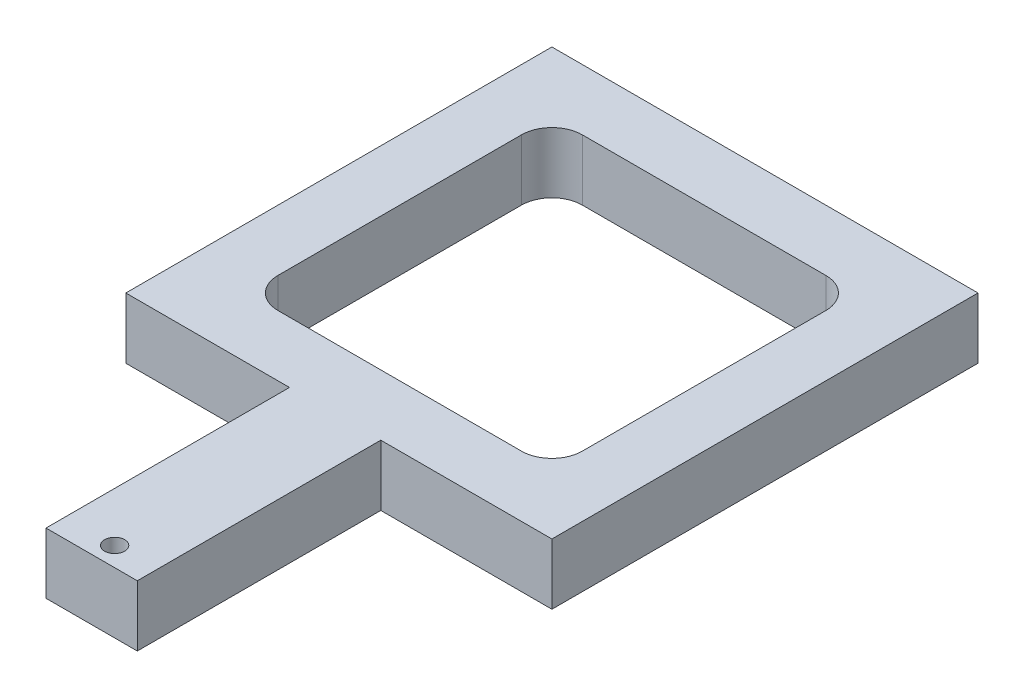
ISO-10303-21;
HEADER;
FILE_DESCRIPTION(('STEP AP214'),'2;1');
FILE_NAME('part.step','',(''),(''),'','','');
FILE_SCHEMA(('AUTOMOTIVE_DESIGN { 1 0 10303 214 1 1 1 1 }'));
ENDSEC;
DATA;
#1=APPLICATION_CONTEXT('core data for automotive mechanical design processes');
#2=APPLICATION_PROTOCOL_DEFINITION('international standard','automotive_design',2000,#1);
#3=PRODUCT_CONTEXT('',#1,'mechanical');
#4=PRODUCT('Part','Part','',(#3));
#5=PRODUCT_RELATED_PRODUCT_CATEGORY('part','',(#4));
#6=PRODUCT_DEFINITION_FORMATION('','',#4);
#7=PRODUCT_DEFINITION_CONTEXT('part definition',#1,'design');
#8=PRODUCT_DEFINITION('design','',#6,#7);
#9=PRODUCT_DEFINITION_SHAPE('','',#8);
#10=(LENGTH_UNIT() NAMED_UNIT(*) SI_UNIT(.MILLI.,.METRE.));
#11=(NAMED_UNIT(*) PLANE_ANGLE_UNIT() SI_UNIT($,.RADIAN.));
#12=(NAMED_UNIT(*) SI_UNIT($,.STERADIAN.) SOLID_ANGLE_UNIT());
#13=UNCERTAINTY_MEASURE_WITH_UNIT(LENGTH_MEASURE(1.E-05),#10,'distance_accuracy_value','');
#14=(GEOMETRIC_REPRESENTATION_CONTEXT(3) GLOBAL_UNCERTAINTY_ASSIGNED_CONTEXT((#13)) GLOBAL_UNIT_ASSIGNED_CONTEXT((#10,
#11,#12)) REPRESENTATION_CONTEXT('',''));
#15=CARTESIAN_POINT('',(0.,0.,0.));
#16=DIRECTION('',(0.,0.,1.));
#17=DIRECTION('',(1.,0.,0.));
#18=AXIS2_PLACEMENT_3D('',#15,#16,#17);
#19=CARTESIAN_POINT('',(0.,10.,0.));
#20=DIRECTION('',(0.,-1.,0.));
#21=DIRECTION('',(0.,0.,-1.));
#22=AXIS2_PLACEMENT_3D('',#19,#20,#21);
#23=PLANE('',#22);
#24=CARTESIAN_POINT('',(0.,10.,71.8381409105254));
#25=DIRECTION('',(0.,1.,0.));
#26=DIRECTION('',(0.,0.,1.));
#27=AXIS2_PLACEMENT_3D('',#24,#25,#26);
#28=CIRCLE('',#27,1.64603405631474);
#29=CARTESIAN_POINT('',(0.,10.,73.4841749668401));
#30=VERTEX_POINT('',#29);
#31=EDGE_CURVE('E369',#30,#30,#28,.T.);
#32=ORIENTED_EDGE('',*,*,#31,.F.);
#33=EDGE_LOOP('',(#32));
#34=FACE_BOUND('',#33,.T.);
#35=DIRECTION('',(1.,0.,0.));
#36=VECTOR('',#35,1.);
#37=CARTESIAN_POINT('',(6.88774581161821,10.,35.));
#38=LINE('',#37,#36);
#39=CARTESIAN_POINT('',(6.88774581161821,10.,35.));
#40=VERTEX_POINT('',#39);
#41=CARTESIAN_POINT('',(35.,10.,35.));
#42=VERTEX_POINT('',#41);
#43=EDGE_CURVE('E215',#40,#42,#38,.T.);
#44=ORIENTED_EDGE('',*,*,#43,.T.);
#45=DIRECTION('',(0.,0.,-1.));
#46=VECTOR('',#45,1.);
#47=CARTESIAN_POINT('',(35.,10.,-35.));
#48=LINE('',#47,#46);
#49=CARTESIAN_POINT('',(35.,10.,-35.));
#50=VERTEX_POINT('',#49);
#51=EDGE_CURVE('E218',#42,#50,#48,.T.);
#52=ORIENTED_EDGE('',*,*,#51,.T.);
#53=DIRECTION('',(-1.,0.,0.));
#54=VECTOR('',#53,1.);
#55=CARTESIAN_POINT('',(-35.,10.,-35.));
#56=LINE('',#55,#54);
#57=CARTESIAN_POINT('',(-35.,10.,-35.));
#58=VERTEX_POINT('',#57);
#59=EDGE_CURVE('E221',#50,#58,#56,.T.);
#60=ORIENTED_EDGE('',*,*,#59,.T.);
#61=DIRECTION('',(0.,0.,1.));
#62=VECTOR('',#61,1.);
#63=CARTESIAN_POINT('',(-35.,10.,-35.));
#64=LINE('',#63,#62);
#65=CARTESIAN_POINT('',(-35.,10.,35.));
#66=VERTEX_POINT('',#65);
#67=EDGE_CURVE('E223',#58,#66,#64,.T.);
#68=ORIENTED_EDGE('',*,*,#67,.T.);
#69=DIRECTION('',(1.,0.,0.));
#70=VECTOR('',#69,1.);
#71=CARTESIAN_POINT('',(-35.,10.,35.));
#72=LINE('',#71,#70);
#73=CARTESIAN_POINT('',(-8.1122541883818,10.,35.));
#74=VERTEX_POINT('',#73);
#75=EDGE_CURVE('E225',#66,#74,#72,.T.);
#76=ORIENTED_EDGE('',*,*,#75,.T.);
#77=DIRECTION('',(0.,0.,1.));
#78=VECTOR('',#77,1.);
#79=CARTESIAN_POINT('',(-8.1122541883818,10.,35.));
#80=LINE('',#79,#78);
#81=CARTESIAN_POINT('',(-8.11225418838179,10.,75.));
#82=VERTEX_POINT('',#81);
#83=EDGE_CURVE('E227',#74,#82,#80,.T.);
#84=ORIENTED_EDGE('',*,*,#83,.T.);
#85=DIRECTION('',(1.,0.,0.));
#86=VECTOR('',#85,1.);
#87=CARTESIAN_POINT('',(-8.11225418838179,10.,75.));
#88=LINE('',#87,#86);
#89=CARTESIAN_POINT('',(6.88774581161821,10.,75.));
#90=VERTEX_POINT('',#89);
#91=EDGE_CURVE('E229',#82,#90,#88,.T.);
#92=ORIENTED_EDGE('',*,*,#91,.T.);
#93=DIRECTION('',(0.,0.,-1.));
#94=VECTOR('',#93,1.);
#95=CARTESIAN_POINT('',(6.88774581161821,10.,75.));
#96=LINE('',#95,#94);
#97=EDGE_CURVE('E231',#90,#40,#96,.T.);
#98=ORIENTED_EDGE('',*,*,#97,.T.);
#99=EDGE_LOOP('',(#44,#52,#60,#68,#76,#84,#92,#98));
#100=FACE_BOUND('',#99,.T.);
#101=CARTESIAN_POINT('',(20.,10.,20.));
#102=DIRECTION('',(0.,1.,0.));
#103=DIRECTION('',(0.,0.,1.));
#104=AXIS2_PLACEMENT_3D('',#101,#102,#103);
#105=CIRCLE('',#104,5.);
#106=CARTESIAN_POINT('',(20.,10.,25.));
#107=VERTEX_POINT('',#106);
#108=CARTESIAN_POINT('',(25.,10.,20.));
#109=VERTEX_POINT('',#108);
#110=EDGE_CURVE('E148',#107,#109,#105,.T.);
#111=ORIENTED_EDGE('',*,*,#110,.F.);
#112=DIRECTION('',(1.,0.,0.));
#113=VECTOR('',#112,1.);
#114=CARTESIAN_POINT('',(-20.,10.,25.));
#115=LINE('',#114,#113);
#116=CARTESIAN_POINT('',(-20.,10.,25.));
#117=VERTEX_POINT('',#116);
#118=EDGE_CURVE('E182',#117,#107,#115,.T.);
#119=ORIENTED_EDGE('',*,*,#118,.F.);
#120=CARTESIAN_POINT('',(-20.,10.,20.));
#121=DIRECTION('',(0.,1.,0.));
#122=DIRECTION('',(0.,0.,-1.));
#123=AXIS2_PLACEMENT_3D('',#120,#121,#122);
#124=CIRCLE('',#123,5.);
#125=CARTESIAN_POINT('',(-25.,10.,20.));
#126=VERTEX_POINT('',#125);
#127=EDGE_CURVE('E180',#126,#117,#124,.T.);
#128=ORIENTED_EDGE('',*,*,#127,.F.);
#129=DIRECTION('',(0.,0.,1.));
#130=VECTOR('',#129,1.);
#131=CARTESIAN_POINT('',(-25.,10.,-20.));
#132=LINE('',#131,#130);
#133=CARTESIAN_POINT('',(-25.,10.,-20.));
#134=VERTEX_POINT('',#133);
#135=EDGE_CURVE('E178',#134,#126,#132,.T.);
#136=ORIENTED_EDGE('',*,*,#135,.F.);
#137=CARTESIAN_POINT('',(-20.,10.,-20.));
#138=DIRECTION('',(0.,1.,0.));
#139=DIRECTION('',(0.,0.,-1.));
#140=AXIS2_PLACEMENT_3D('',#137,#138,#139);
#141=CIRCLE('',#140,5.);
#142=CARTESIAN_POINT('',(-20.,10.,-25.));
#143=VERTEX_POINT('',#142);
#144=EDGE_CURVE('E176',#143,#134,#141,.T.);
#145=ORIENTED_EDGE('',*,*,#144,.F.);
#146=DIRECTION('',(-1.,0.,0.));
#147=VECTOR('',#146,1.);
#148=CARTESIAN_POINT('',(-20.,10.,-25.));
#149=LINE('',#148,#147);
#150=CARTESIAN_POINT('',(20.,10.,-25.));
#151=VERTEX_POINT('',#150);
#152=EDGE_CURVE('E171',#151,#143,#149,.T.);
#153=ORIENTED_EDGE('',*,*,#152,.F.);
#154=CARTESIAN_POINT('',(20.,10.,-20.));
#155=DIRECTION('',(0.,1.,0.));
#156=DIRECTION('',(0.,0.,1.));
#157=AXIS2_PLACEMENT_3D('',#154,#155,#156);
#158=CIRCLE('',#157,5.);
#159=CARTESIAN_POINT('',(25.,10.,-20.));
#160=VERTEX_POINT('',#159);
#161=EDGE_CURVE('E169',#160,#151,#158,.T.);
#162=ORIENTED_EDGE('',*,*,#161,.F.);
#163=DIRECTION('',(0.,0.,-1.));
#164=VECTOR('',#163,1.);
#165=CARTESIAN_POINT('',(25.,10.,-20.));
#166=LINE('',#165,#164);
#167=EDGE_CURVE('E156',#109,#160,#166,.T.);
#168=ORIENTED_EDGE('',*,*,#167,.F.);
#169=EDGE_LOOP('',(#111,#119,#128,#136,#145,#153,#162,#168));
#170=FACE_BOUND('',#169,.T.);
#171=ADVANCED_FACE('F35',(#34,#100,#170),#23,.F.);
#172=CARTESIAN_POINT('',(0.,0.,0.));
#173=DIRECTION('',(0.,-1.,0.));
#174=DIRECTION('',(0.,0.,-1.));
#175=AXIS2_PLACEMENT_3D('',#172,#173,#174);
#176=PLANE('',#175);
#177=CARTESIAN_POINT('',(0.,0.,71.8381409105254));
#178=DIRECTION('',(0.,1.,0.));
#179=DIRECTION('',(0.,0.,1.));
#180=AXIS2_PLACEMENT_3D('',#177,#178,#179);
#181=CIRCLE('',#180,1.64603405631474);
#182=CARTESIAN_POINT('',(0.,0.,73.4841749668401));
#183=VERTEX_POINT('',#182);
#184=EDGE_CURVE('E185',#183,#183,#181,.T.);
#185=ORIENTED_EDGE('',*,*,#184,.T.);
#186=EDGE_LOOP('',(#185));
#187=FACE_BOUND('',#186,.T.);
#188=DIRECTION('',(1.,0.,0.));
#189=VECTOR('',#188,1.);
#190=CARTESIAN_POINT('',(6.88774581161821,0.,35.));
#191=LINE('',#190,#189);
#192=CARTESIAN_POINT('',(6.88774581161821,0.,35.));
#193=VERTEX_POINT('',#192);
#194=CARTESIAN_POINT('',(35.,0.,35.));
#195=VERTEX_POINT('',#194);
#196=EDGE_CURVE('E164',#193,#195,#191,.T.);
#197=ORIENTED_EDGE('',*,*,#196,.F.);
#198=DIRECTION('',(0.,0.,-1.));
#199=VECTOR('',#198,1.);
#200=CARTESIAN_POINT('',(6.88774581161821,0.,75.));
#201=LINE('',#200,#199);
#202=CARTESIAN_POINT('',(6.88774581161821,0.,75.));
#203=VERTEX_POINT('',#202);
#204=EDGE_CURVE('E219',#203,#193,#201,.T.);
#205=ORIENTED_EDGE('',*,*,#204,.F.);
#206=DIRECTION('',(1.,0.,0.));
#207=VECTOR('',#206,1.);
#208=CARTESIAN_POINT('',(-8.11225418838179,0.,75.));
#209=LINE('',#208,#207);
#210=CARTESIAN_POINT('',(-8.11225418838179,0.,75.));
#211=VERTEX_POINT('',#210);
#212=EDGE_CURVE('E246',#211,#203,#209,.T.);
#213=ORIENTED_EDGE('',*,*,#212,.F.);
#214=DIRECTION('',(0.,0.,1.));
#215=VECTOR('',#214,1.);
#216=CARTESIAN_POINT('',(-8.1122541883818,0.,35.));
#217=LINE('',#216,#215);
#218=CARTESIAN_POINT('',(-8.1122541883818,0.,35.));
#219=VERTEX_POINT('',#218);
#220=EDGE_CURVE('E244',#219,#211,#217,.T.);
#221=ORIENTED_EDGE('',*,*,#220,.F.);
#222=DIRECTION('',(1.,0.,0.));
#223=VECTOR('',#222,1.);
#224=CARTESIAN_POINT('',(-35.,0.,35.));
#225=LINE('',#224,#223);
#226=CARTESIAN_POINT('',(-35.,0.,35.));
#227=VERTEX_POINT('',#226);
#228=EDGE_CURVE('E242',#227,#219,#225,.T.);
#229=ORIENTED_EDGE('',*,*,#228,.F.);
#230=DIRECTION('',(0.,0.,1.));
#231=VECTOR('',#230,1.);
#232=CARTESIAN_POINT('',(-35.,0.,-35.));
#233=LINE('',#232,#231);
#234=CARTESIAN_POINT('',(-35.,0.,-35.));
#235=VERTEX_POINT('',#234);
#236=EDGE_CURVE('E240',#235,#227,#233,.T.);
#237=ORIENTED_EDGE('',*,*,#236,.F.);
#238=DIRECTION('',(-1.,0.,0.));
#239=VECTOR('',#238,1.);
#240=CARTESIAN_POINT('',(-35.,0.,-35.));
#241=LINE('',#240,#239);
#242=CARTESIAN_POINT('',(35.,0.,-35.));
#243=VERTEX_POINT('',#242);
#244=EDGE_CURVE('E238',#243,#235,#241,.T.);
#245=ORIENTED_EDGE('',*,*,#244,.F.);
#246=DIRECTION('',(0.,0.,-1.));
#247=VECTOR('',#246,1.);
#248=CARTESIAN_POINT('',(35.,0.,-35.));
#249=LINE('',#248,#247);
#250=EDGE_CURVE('E236',#195,#243,#249,.T.);
#251=ORIENTED_EDGE('',*,*,#250,.F.);
#252=EDGE_LOOP('',(#197,#205,#213,#221,#229,#237,#245,#251));
#253=FACE_BOUND('',#252,.T.);
#254=DIRECTION('',(1.,0.,0.));
#255=VECTOR('',#254,1.);
#256=CARTESIAN_POINT('',(-20.,0.,25.));
#257=LINE('',#256,#255);
#258=CARTESIAN_POINT('',(-20.,0.,25.));
#259=VERTEX_POINT('',#258);
#260=CARTESIAN_POINT('',(20.,0.,25.));
#261=VERTEX_POINT('',#260);
#262=EDGE_CURVE('E157',#259,#261,#257,.T.);
#263=ORIENTED_EDGE('',*,*,#262,.T.);
#264=CARTESIAN_POINT('',(20.,0.,20.));
#265=DIRECTION('',(0.,1.,0.));
#266=DIRECTION('',(0.,0.,1.));
#267=AXIS2_PLACEMENT_3D('',#264,#265,#266);
#268=CIRCLE('',#267,5.);
#269=CARTESIAN_POINT('',(25.,0.,20.));
#270=VERTEX_POINT('',#269);
#271=EDGE_CURVE('E58',#261,#270,#268,.T.);
#272=ORIENTED_EDGE('',*,*,#271,.T.);
#273=DIRECTION('',(0.,0.,-1.));
#274=VECTOR('',#273,1.);
#275=CARTESIAN_POINT('',(25.,0.,-20.));
#276=LINE('',#275,#274);
#277=CARTESIAN_POINT('',(25.,0.,-20.));
#278=VERTEX_POINT('',#277);
#279=EDGE_CURVE('E163',#270,#278,#276,.T.);
#280=ORIENTED_EDGE('',*,*,#279,.T.);
#281=CARTESIAN_POINT('',(20.,0.,-20.));
#282=DIRECTION('',(0.,1.,0.));
#283=DIRECTION('',(0.,0.,1.));
#284=AXIS2_PLACEMENT_3D('',#281,#282,#283);
#285=CIRCLE('',#284,5.);
#286=CARTESIAN_POINT('',(20.,0.,-25.));
#287=VERTEX_POINT('',#286);
#288=EDGE_CURVE('E187',#278,#287,#285,.T.);
#289=ORIENTED_EDGE('',*,*,#288,.T.);
#290=DIRECTION('',(-1.,0.,0.));
#291=VECTOR('',#290,1.);
#292=CARTESIAN_POINT('',(-20.,0.,-25.));
#293=LINE('',#292,#291);
#294=CARTESIAN_POINT('',(-20.,0.,-25.));
#295=VERTEX_POINT('',#294);
#296=EDGE_CURVE('E190',#287,#295,#293,.T.);
#297=ORIENTED_EDGE('',*,*,#296,.T.);
#298=CARTESIAN_POINT('',(-20.,0.,-20.));
#299=DIRECTION('',(0.,1.,0.));
#300=DIRECTION('',(0.,0.,-1.));
#301=AXIS2_PLACEMENT_3D('',#298,#299,#300);
#302=CIRCLE('',#301,5.);
#303=CARTESIAN_POINT('',(-25.,0.,-20.));
#304=VERTEX_POINT('',#303);
#305=EDGE_CURVE('E193',#295,#304,#302,.T.);
#306=ORIENTED_EDGE('',*,*,#305,.T.);
#307=DIRECTION('',(0.,0.,1.));
#308=VECTOR('',#307,1.);
#309=CARTESIAN_POINT('',(-25.,0.,-20.));
#310=LINE('',#309,#308);
#311=CARTESIAN_POINT('',(-25.,0.,20.));
#312=VERTEX_POINT('',#311);
#313=EDGE_CURVE('E196',#304,#312,#310,.T.);
#314=ORIENTED_EDGE('',*,*,#313,.T.);
#315=CARTESIAN_POINT('',(-20.,0.,20.));
#316=DIRECTION('',(0.,1.,0.));
#317=DIRECTION('',(0.,0.,-1.));
#318=AXIS2_PLACEMENT_3D('',#315,#316,#317);
#319=CIRCLE('',#318,5.);
#320=EDGE_CURVE('E199',#312,#259,#319,.T.);
#321=ORIENTED_EDGE('',*,*,#320,.T.);
#322=EDGE_LOOP('',(#263,#272,#280,#289,#297,#306,#314,#321));
#323=FACE_BOUND('',#322,.T.);
#324=ADVANCED_FACE('F276',(#187,#253,#323),#176,.T.);
#325=CARTESIAN_POINT('',(6.88774581161821,10.,35.));
#326=DIRECTION('',(0.,0.,-1.));
#327=DIRECTION('',(-1.,0.,0.));
#328=AXIS2_PLACEMENT_3D('',#325,#326,#327);
#329=PLANE('',#328);
#330=ORIENTED_EDGE('',*,*,#196,.T.);
#331=DIRECTION('',(0.,-1.,0.));
#332=VECTOR('',#331,1.);
#333=CARTESIAN_POINT('',(35.,10.,35.));
#334=LINE('',#333,#332);
#335=EDGE_CURVE('E11',#42,#195,#334,.T.);
#336=ORIENTED_EDGE('',*,*,#335,.F.);
#337=ORIENTED_EDGE('',*,*,#43,.F.);
#338=DIRECTION('',(0.,-1.,0.));
#339=VECTOR('',#338,1.);
#340=CARTESIAN_POINT('',(6.88774581161821,10.,35.));
#341=LINE('',#340,#339);
#342=EDGE_CURVE('E233',#40,#193,#341,.T.);
#343=ORIENTED_EDGE('',*,*,#342,.T.);
#344=EDGE_LOOP('',(#330,#336,#337,#343));
#345=FACE_BOUND('',#344,.T.);
#346=ADVANCED_FACE('F37',(#345),#329,.F.);
#347=CARTESIAN_POINT('',(35.,10.,-35.));
#348=DIRECTION('',(-1.,0.,0.));
#349=DIRECTION('',(0.,0.,1.));
#350=AXIS2_PLACEMENT_3D('',#347,#348,#349);
#351=PLANE('',#350);
#352=ORIENTED_EDGE('',*,*,#250,.T.);
#353=DIRECTION('',(0.,-1.,0.));
#354=VECTOR('',#353,1.);
#355=CARTESIAN_POINT('',(35.,10.,-35.));
#356=LINE('',#355,#354);
#357=EDGE_CURVE('E43',#50,#243,#356,.T.);
#358=ORIENTED_EDGE('',*,*,#357,.F.);
#359=ORIENTED_EDGE('',*,*,#51,.F.);
#360=ORIENTED_EDGE('',*,*,#335,.T.);
#361=EDGE_LOOP('',(#352,#358,#359,#360));
#362=FACE_BOUND('',#361,.T.);
#363=ADVANCED_FACE('F293',(#362),#351,.F.);
#364=CARTESIAN_POINT('',(-35.,10.,-35.));
#365=DIRECTION('',(0.,0.,1.));
#366=DIRECTION('',(1.,0.,0.));
#367=AXIS2_PLACEMENT_3D('',#364,#365,#366);
#368=PLANE('',#367);
#369=ORIENTED_EDGE('',*,*,#244,.T.);
#370=DIRECTION('',(0.,-1.,0.));
#371=VECTOR('',#370,1.);
#372=CARTESIAN_POINT('',(-35.,10.,-35.));
#373=LINE('',#372,#371);
#374=EDGE_CURVE('E263',#58,#235,#373,.T.);
#375=ORIENTED_EDGE('',*,*,#374,.F.);
#376=ORIENTED_EDGE('',*,*,#59,.F.);
#377=ORIENTED_EDGE('',*,*,#357,.T.);
#378=EDGE_LOOP('',(#369,#375,#376,#377));
#379=FACE_BOUND('',#378,.T.);
#380=ADVANCED_FACE('F270',(#379),#368,.F.);
#381=CARTESIAN_POINT('',(-35.,10.,-35.));
#382=DIRECTION('',(1.,0.,0.));
#383=DIRECTION('',(0.,0.,-1.));
#384=AXIS2_PLACEMENT_3D('',#381,#382,#383);
#385=PLANE('',#384);
#386=ORIENTED_EDGE('',*,*,#236,.T.);
#387=DIRECTION('',(0.,-1.,0.));
#388=VECTOR('',#387,1.);
#389=CARTESIAN_POINT('',(-35.,10.,35.));
#390=LINE('',#389,#388);
#391=EDGE_CURVE('E260',#66,#227,#390,.T.);
#392=ORIENTED_EDGE('',*,*,#391,.F.);
#393=ORIENTED_EDGE('',*,*,#67,.F.);
#394=ORIENTED_EDGE('',*,*,#374,.T.);
#395=EDGE_LOOP('',(#386,#392,#393,#394));
#396=FACE_BOUND('',#395,.T.);
#397=ADVANCED_FACE('F282',(#396),#385,.F.);
#398=CARTESIAN_POINT('',(-35.,10.,35.));
#399=DIRECTION('',(0.,0.,-1.));
#400=DIRECTION('',(-1.,0.,0.));
#401=AXIS2_PLACEMENT_3D('',#398,#399,#400);
#402=PLANE('',#401);
#403=ORIENTED_EDGE('',*,*,#228,.T.);
#404=DIRECTION('',(0.,-1.,0.));
#405=VECTOR('',#404,1.);
#406=CARTESIAN_POINT('',(-8.1122541883818,10.,35.));
#407=LINE('',#406,#405);
#408=EDGE_CURVE('E257',#74,#219,#407,.T.);
#409=ORIENTED_EDGE('',*,*,#408,.F.);
#410=ORIENTED_EDGE('',*,*,#75,.F.);
#411=ORIENTED_EDGE('',*,*,#391,.T.);
#412=EDGE_LOOP('',(#403,#409,#410,#411));
#413=FACE_BOUND('',#412,.T.);
#414=ADVANCED_FACE('F286',(#413),#402,.F.);
#415=CARTESIAN_POINT('',(-8.1122541883818,10.,35.));
#416=DIRECTION('',(1.,0.,0.));
#417=DIRECTION('',(0.,0.,-1.));
#418=AXIS2_PLACEMENT_3D('',#415,#416,#417);
#419=PLANE('',#418);
#420=ORIENTED_EDGE('',*,*,#220,.T.);
#421=DIRECTION('',(0.,-1.,0.));
#422=VECTOR('',#421,1.);
#423=CARTESIAN_POINT('',(-8.11225418838179,10.,75.));
#424=LINE('',#423,#422);
#425=EDGE_CURVE('E254',#82,#211,#424,.T.);
#426=ORIENTED_EDGE('',*,*,#425,.F.);
#427=ORIENTED_EDGE('',*,*,#83,.F.);
#428=ORIENTED_EDGE('',*,*,#408,.T.);
#429=EDGE_LOOP('',(#420,#426,#427,#428));
#430=FACE_BOUND('',#429,.T.);
#431=ADVANCED_FACE('F306',(#430),#419,.F.);
#432=CARTESIAN_POINT('',(-8.11225418838179,10.,75.));
#433=DIRECTION('',(0.,0.,-1.));
#434=DIRECTION('',(-1.,0.,0.));
#435=AXIS2_PLACEMENT_3D('',#432,#433,#434);
#436=PLANE('',#435);
#437=ORIENTED_EDGE('',*,*,#212,.T.);
#438=DIRECTION('',(0.,-1.,0.));
#439=VECTOR('',#438,1.);
#440=CARTESIAN_POINT('',(6.88774581161821,10.,75.));
#441=LINE('',#440,#439);
#442=EDGE_CURVE('E251',#90,#203,#441,.T.);
#443=ORIENTED_EDGE('',*,*,#442,.F.);
#444=ORIENTED_EDGE('',*,*,#91,.F.);
#445=ORIENTED_EDGE('',*,*,#425,.T.);
#446=EDGE_LOOP('',(#437,#443,#444,#445));
#447=FACE_BOUND('',#446,.T.);
#448=ADVANCED_FACE('F304',(#447),#436,.F.);
#449=CARTESIAN_POINT('',(6.88774581161821,10.,75.));
#450=DIRECTION('',(-1.,0.,0.));
#451=DIRECTION('',(0.,0.,1.));
#452=AXIS2_PLACEMENT_3D('',#449,#450,#451);
#453=PLANE('',#452);
#454=ORIENTED_EDGE('',*,*,#204,.T.);
#455=ORIENTED_EDGE('',*,*,#342,.F.);
#456=ORIENTED_EDGE('',*,*,#97,.F.);
#457=ORIENTED_EDGE('',*,*,#442,.T.);
#458=EDGE_LOOP('',(#454,#455,#456,#457));
#459=FACE_BOUND('',#458,.T.);
#460=ADVANCED_FACE('F299',(#459),#453,.F.);
#461=CARTESIAN_POINT('',(20.,10.,20.));
#462=DIRECTION('',(0.,-1.,0.));
#463=DIRECTION('',(0.,0.,-1.));
#464=AXIS2_PLACEMENT_3D('',#461,#462,#463);
#465=CYLINDRICAL_SURFACE('',#464,5.);
#466=ORIENTED_EDGE('',*,*,#271,.F.);
#467=DIRECTION('',(0.,-1.,0.));
#468=VECTOR('',#467,1.);
#469=CARTESIAN_POINT('',(20.,10.,25.));
#470=LINE('',#469,#468);
#471=EDGE_CURVE('E152',#107,#261,#470,.T.);
#472=ORIENTED_EDGE('',*,*,#471,.F.);
#473=ORIENTED_EDGE('',*,*,#110,.T.);
#474=DIRECTION('',(0.,-1.,0.));
#475=VECTOR('',#474,1.);
#476=CARTESIAN_POINT('',(25.,10.,20.));
#477=LINE('',#476,#475);
#478=EDGE_CURVE('E151',#109,#270,#477,.T.);
#479=ORIENTED_EDGE('',*,*,#478,.T.);
#480=EDGE_LOOP('',(#466,#472,#473,#479));
#481=FACE_BOUND('',#480,.T.);
#482=ADVANCED_FACE('F150',(#481),#465,.F.);
#483=CARTESIAN_POINT('',(25.,10.,-20.));
#484=DIRECTION('',(-1.,0.,0.));
#485=DIRECTION('',(0.,0.,1.));
#486=AXIS2_PLACEMENT_3D('',#483,#484,#485);
#487=PLANE('',#486);
#488=ORIENTED_EDGE('',*,*,#279,.F.);
#489=ORIENTED_EDGE('',*,*,#478,.F.);
#490=ORIENTED_EDGE('',*,*,#167,.T.);
#491=DIRECTION('',(0.,-1.,0.));
#492=VECTOR('',#491,1.);
#493=CARTESIAN_POINT('',(25.,10.,-20.));
#494=LINE('',#493,#492);
#495=EDGE_CURVE('E165',#160,#278,#494,.T.);
#496=ORIENTED_EDGE('',*,*,#495,.T.);
#497=EDGE_LOOP('',(#488,#489,#490,#496));
#498=FACE_BOUND('',#497,.T.);
#499=ADVANCED_FACE('F160',(#498),#487,.T.);
#500=CARTESIAN_POINT('',(20.,10.,-20.));
#501=DIRECTION('',(0.,-1.,0.));
#502=DIRECTION('',(0.,0.,-1.));
#503=AXIS2_PLACEMENT_3D('',#500,#501,#502);
#504=CYLINDRICAL_SURFACE('',#503,5.);
#505=ORIENTED_EDGE('',*,*,#288,.F.);
#506=ORIENTED_EDGE('',*,*,#495,.F.);
#507=ORIENTED_EDGE('',*,*,#161,.T.);
#508=DIRECTION('',(0.,-1.,0.));
#509=VECTOR('',#508,1.);
#510=CARTESIAN_POINT('',(20.,10.,-25.));
#511=LINE('',#510,#509);
#512=EDGE_CURVE('E212',#151,#287,#511,.T.);
#513=ORIENTED_EDGE('',*,*,#512,.T.);
#514=EDGE_LOOP('',(#505,#506,#507,#513));
#515=FACE_BOUND('',#514,.T.);
#516=ADVANCED_FACE('F334',(#515),#504,.F.);
#517=CARTESIAN_POINT('',(-20.,10.,-25.));
#518=DIRECTION('',(0.,0.,1.));
#519=DIRECTION('',(1.,0.,0.));
#520=AXIS2_PLACEMENT_3D('',#517,#518,#519);
#521=PLANE('',#520);
#522=ORIENTED_EDGE('',*,*,#296,.F.);
#523=ORIENTED_EDGE('',*,*,#512,.F.);
#524=ORIENTED_EDGE('',*,*,#152,.T.);
#525=DIRECTION('',(0.,-1.,0.));
#526=VECTOR('',#525,1.);
#527=CARTESIAN_POINT('',(-20.,10.,-25.));
#528=LINE('',#527,#526);
#529=EDGE_CURVE('E210',#143,#295,#528,.T.);
#530=ORIENTED_EDGE('',*,*,#529,.T.);
#531=EDGE_LOOP('',(#522,#523,#524,#530));
#532=FACE_BOUND('',#531,.T.);
#533=ADVANCED_FACE('F338',(#532),#521,.T.);
#534=CARTESIAN_POINT('',(-20.,10.,-20.));
#535=DIRECTION('',(0.,-1.,0.));
#536=DIRECTION('',(0.,0.,-1.));
#537=AXIS2_PLACEMENT_3D('',#534,#535,#536);
#538=CYLINDRICAL_SURFACE('',#537,5.);
#539=ORIENTED_EDGE('',*,*,#305,.F.);
#540=ORIENTED_EDGE('',*,*,#529,.F.);
#541=ORIENTED_EDGE('',*,*,#144,.T.);
#542=DIRECTION('',(0.,-1.,0.));
#543=VECTOR('',#542,1.);
#544=CARTESIAN_POINT('',(-25.,10.,-20.));
#545=LINE('',#544,#543);
#546=EDGE_CURVE('E208',#134,#304,#545,.T.);
#547=ORIENTED_EDGE('',*,*,#546,.T.);
#548=EDGE_LOOP('',(#539,#540,#541,#547));
#549=FACE_BOUND('',#548,.T.);
#550=ADVANCED_FACE('F344',(#549),#538,.F.);
#551=CARTESIAN_POINT('',(-25.,10.,-20.));
#552=DIRECTION('',(1.,0.,0.));
#553=DIRECTION('',(0.,0.,-1.));
#554=AXIS2_PLACEMENT_3D('',#551,#552,#553);
#555=PLANE('',#554);
#556=ORIENTED_EDGE('',*,*,#313,.F.);
#557=ORIENTED_EDGE('',*,*,#546,.F.);
#558=ORIENTED_EDGE('',*,*,#135,.T.);
#559=DIRECTION('',(0.,-1.,0.));
#560=VECTOR('',#559,1.);
#561=CARTESIAN_POINT('',(-25.,10.,20.));
#562=LINE('',#561,#560);
#563=EDGE_CURVE('E206',#126,#312,#562,.T.);
#564=ORIENTED_EDGE('',*,*,#563,.T.);
#565=EDGE_LOOP('',(#556,#557,#558,#564));
#566=FACE_BOUND('',#565,.T.);
#567=ADVANCED_FACE('F348',(#566),#555,.T.);
#568=CARTESIAN_POINT('',(-20.,10.,20.));
#569=DIRECTION('',(0.,-1.,0.));
#570=DIRECTION('',(0.,0.,-1.));
#571=AXIS2_PLACEMENT_3D('',#568,#569,#570);
#572=CYLINDRICAL_SURFACE('',#571,5.);
#573=ORIENTED_EDGE('',*,*,#320,.F.);
#574=ORIENTED_EDGE('',*,*,#563,.F.);
#575=ORIENTED_EDGE('',*,*,#127,.T.);
#576=DIRECTION('',(0.,-1.,0.));
#577=VECTOR('',#576,1.);
#578=CARTESIAN_POINT('',(-20.,10.,25.));
#579=LINE('',#578,#577);
#580=EDGE_CURVE('E50',#117,#259,#579,.T.);
#581=ORIENTED_EDGE('',*,*,#580,.T.);
#582=EDGE_LOOP('',(#573,#574,#575,#581));
#583=FACE_BOUND('',#582,.T.);
#584=ADVANCED_FACE('F352',(#583),#572,.F.);
#585=CARTESIAN_POINT('',(-20.,10.,25.));
#586=DIRECTION('',(0.,0.,-1.));
#587=DIRECTION('',(-1.,0.,0.));
#588=AXIS2_PLACEMENT_3D('',#585,#586,#587);
#589=PLANE('',#588);
#590=ORIENTED_EDGE('',*,*,#262,.F.);
#591=ORIENTED_EDGE('',*,*,#580,.F.);
#592=ORIENTED_EDGE('',*,*,#118,.T.);
#593=ORIENTED_EDGE('',*,*,#471,.T.);
#594=EDGE_LOOP('',(#590,#591,#592,#593));
#595=FACE_BOUND('',#594,.T.);
#596=ADVANCED_FACE('F356',(#595),#589,.T.);
#597=CARTESIAN_POINT('',(0.,0.,71.8381409105254));
#598=DIRECTION('',(0.,1.,0.));
#599=DIRECTION('',(0.,0.,1.));
#600=AXIS2_PLACEMENT_3D('',#597,#598,#599);
#601=CYLINDRICAL_SURFACE('',#600,1.64603405631474);
#602=ORIENTED_EDGE('',*,*,#184,.F.);
#603=EDGE_LOOP('',(#602));
#604=FACE_BOUND('',#603,.T.);
#605=ORIENTED_EDGE('',*,*,#31,.T.);
#606=EDGE_LOOP('',(#605));
#607=FACE_BOUND('',#606,.T.);
#608=ADVANCED_FACE('F360',(#604,#607),#601,.F.);
#609=CLOSED_SHELL('',(#171,#324,#346,#363,#380,#397,#414,#431,#448,#460,#482,#499,#516,#533,
#550,#567,#584,#596,#608));
#610=MANIFOLD_SOLID_BREP('B2',#609);
#611=ADVANCED_BREP_SHAPE_REPRESENTATION('',(#18,#610),#14);
#612=SHAPE_DEFINITION_REPRESENTATION(#9,#611);
ENDSEC;
END-ISO-10303-21;
